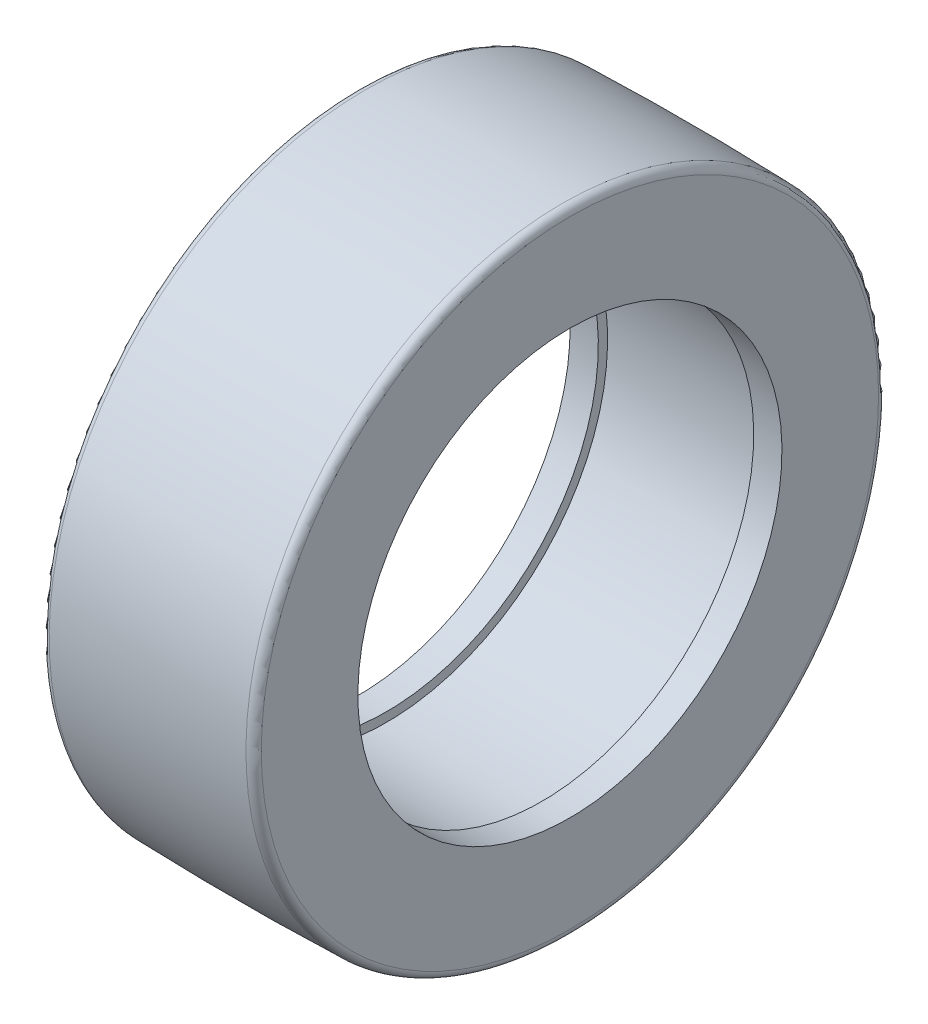
ISO-10303-21;
HEADER;
FILE_DESCRIPTION(('STEP AP214'),'2;1');
FILE_NAME('part.step','',(''),(''),'','','');
FILE_SCHEMA(('AUTOMOTIVE_DESIGN { 1 0 10303 214 1 1 1 1 }'));
ENDSEC;
DATA;
#1=APPLICATION_CONTEXT('core data for automotive mechanical design processes');
#2=APPLICATION_PROTOCOL_DEFINITION('international standard','automotive_design',2000,#1);
#3=PRODUCT_CONTEXT('',#1,'mechanical');
#4=PRODUCT('Part','Part','',(#3));
#5=PRODUCT_RELATED_PRODUCT_CATEGORY('part','',(#4));
#6=PRODUCT_DEFINITION_FORMATION('','',#4);
#7=PRODUCT_DEFINITION_CONTEXT('part definition',#1,'design');
#8=PRODUCT_DEFINITION('design','',#6,#7);
#9=PRODUCT_DEFINITION_SHAPE('','',#8);
#10=(LENGTH_UNIT() NAMED_UNIT(*) SI_UNIT(.MILLI.,.METRE.));
#11=(NAMED_UNIT(*) PLANE_ANGLE_UNIT() SI_UNIT($,.RADIAN.));
#12=(NAMED_UNIT(*) SI_UNIT($,.STERADIAN.) SOLID_ANGLE_UNIT());
#13=UNCERTAINTY_MEASURE_WITH_UNIT(LENGTH_MEASURE(1.E-05),#10,'distance_accuracy_value','');
#14=(GEOMETRIC_REPRESENTATION_CONTEXT(3) GLOBAL_UNCERTAINTY_ASSIGNED_CONTEXT((#13)) GLOBAL_UNIT_ASSIGNED_CONTEXT((#10,
#11,#12)) REPRESENTATION_CONTEXT('',''));
#15=CARTESIAN_POINT('',(0.,0.,0.));
#16=DIRECTION('',(0.,0.,1.));
#17=DIRECTION('',(1.,0.,0.));
#18=AXIS2_PLACEMENT_3D('',#15,#16,#17);
#19=CARTESIAN_POINT('',(1.1,0.,0.));
#20=DIRECTION('',(1.,0.,0.));
#21=DIRECTION('',(0.,0.,-1.));
#22=AXIS2_PLACEMENT_3D('',#19,#20,#21);
#23=TOROIDAL_SURFACE('',#22,43.7063264086391,1.1);
#24=CARTESIAN_POINT('',(0.,0.,0.));
#25=DIRECTION('',(1.,0.,0.));
#26=DIRECTION('',(0.,1.,0.));
#27=AXIS2_PLACEMENT_3D('',#24,#25,#26);
#28=CIRCLE('',#27,43.7063264086391);
#29=CARTESIAN_POINT('',(0.,43.7063264086391,0.));
#30=VERTEX_POINT('',#29);
#31=EDGE_CURVE('E11',#30,#30,#28,.T.);
#32=ORIENTED_EDGE('',*,*,#31,.T.);
#33=EDGE_LOOP('',(#32));
#34=FACE_BOUND('',#33,.T.);
#35=CARTESIAN_POINT('',(1.0693525756665,0.,0.));
#36=DIRECTION('',(1.,0.,0.));
#37=DIRECTION('',(0.,1.,0.));
#38=AXIS2_PLACEMENT_3D('',#35,#36,#37);
#39=CIRCLE('',#38,44.805899387291);
#40=CARTESIAN_POINT('',(1.0693525756665,44.805899387291,0.));
#41=VERTEX_POINT('',#40);
#42=EDGE_CURVE('E110',#41,#41,#39,.T.);
#43=ORIENTED_EDGE('',*,*,#42,.F.);
#44=EDGE_LOOP('',(#43));
#45=FACE_BOUND('',#44,.T.);
#46=ADVANCED_FACE('F17',(#34,#45),#23,.T.);
#47=CARTESIAN_POINT('',(0.,36.8669132043195,0.));
#48=DIRECTION('',(-1.,0.,0.));
#49=DIRECTION('',(0.,-1.,0.));
#50=AXIS2_PLACEMENT_3D('',#47,#48,#49);
#51=PLANE('',#50);
#52=CARTESIAN_POINT('',(0.,0.,0.));
#53=DIRECTION('',(1.,0.,0.));
#54=DIRECTION('',(0.,1.,0.));
#55=AXIS2_PLACEMENT_3D('',#52,#53,#54);
#56=CIRCLE('',#55,30.0275);
#57=CARTESIAN_POINT('',(0.,30.0275,0.));
#58=VERTEX_POINT('',#57);
#59=EDGE_CURVE('E26',#58,#58,#56,.T.);
#60=ORIENTED_EDGE('',*,*,#59,.T.);
#61=EDGE_LOOP('',(#60));
#62=FACE_BOUND('',#61,.T.);
#63=ORIENTED_EDGE('',*,*,#31,.F.);
#64=EDGE_LOOP('',(#63));
#65=FACE_BOUND('',#64,.T.);
#66=ADVANCED_FACE('F19',(#62,#65),#51,.T.);
#67=CARTESIAN_POINT('',(2.,0.,0.));
#68=DIRECTION('',(-1.,0.,0.));
#69=DIRECTION('',(0.,1.,0.));
#70=AXIS2_PLACEMENT_3D('',#67,#68,#69);
#71=CYLINDRICAL_SURFACE('',#70,30.0275);
#72=CARTESIAN_POINT('',(4.,0.,0.));
#73=DIRECTION('',(1.,0.,0.));
#74=DIRECTION('',(0.,1.,0.));
#75=AXIS2_PLACEMENT_3D('',#72,#73,#74);
#76=CIRCLE('',#75,30.0275);
#77=CARTESIAN_POINT('',(4.,30.0275,0.));
#78=VERTEX_POINT('',#77);
#79=EDGE_CURVE('E68',#78,#78,#76,.T.);
#80=ORIENTED_EDGE('',*,*,#79,.T.);
#81=EDGE_LOOP('',(#80));
#82=FACE_BOUND('',#81,.T.);
#83=ORIENTED_EDGE('',*,*,#59,.F.);
#84=EDGE_LOOP('',(#83));
#85=FACE_BOUND('',#84,.T.);
#86=ADVANCED_FACE('F79',(#82,#85),#71,.F.);
#87=CARTESIAN_POINT('',(4.,30.68375,0.));
#88=DIRECTION('',(1.,0.,0.));
#89=DIRECTION('',(0.,1.,0.));
#90=AXIS2_PLACEMENT_3D('',#87,#88,#89);
#91=PLANE('',#90);
#92=CARTESIAN_POINT('',(4.,0.,0.));
#93=DIRECTION('',(1.,0.,0.));
#94=DIRECTION('',(0.,1.,0.));
#95=AXIS2_PLACEMENT_3D('',#92,#93,#94);
#96=CIRCLE('',#95,31.34);
#97=CARTESIAN_POINT('',(4.,31.34,0.));
#98=VERTEX_POINT('',#97);
#99=EDGE_CURVE('E64',#98,#98,#96,.T.);
#100=ORIENTED_EDGE('',*,*,#99,.T.);
#101=EDGE_LOOP('',(#100));
#102=FACE_BOUND('',#101,.T.);
#103=ORIENTED_EDGE('',*,*,#79,.F.);
#104=EDGE_LOOP('',(#103));
#105=FACE_BOUND('',#104,.T.);
#106=ADVANCED_FACE('F65',(#102,#105),#91,.T.);
#107=CARTESIAN_POINT('',(15.,0.,0.));
#108=DIRECTION('',(-1.,0.,0.));
#109=DIRECTION('',(0.,1.,0.));
#110=AXIS2_PLACEMENT_3D('',#107,#108,#109);
#111=CYLINDRICAL_SURFACE('',#110,31.34);
#112=CARTESIAN_POINT('',(26.,0.,0.));
#113=DIRECTION('',(1.,0.,0.));
#114=DIRECTION('',(0.,1.,0.));
#115=AXIS2_PLACEMENT_3D('',#112,#113,#114);
#116=CIRCLE('',#115,31.34);
#117=CARTESIAN_POINT('',(26.,31.34,0.));
#118=VERTEX_POINT('',#117);
#119=EDGE_CURVE('E60',#118,#118,#116,.T.);
#120=ORIENTED_EDGE('',*,*,#119,.T.);
#121=EDGE_LOOP('',(#120));
#122=FACE_BOUND('',#121,.T.);
#123=ORIENTED_EDGE('',*,*,#99,.F.);
#124=EDGE_LOOP('',(#123));
#125=FACE_BOUND('',#124,.T.);
#126=ADVANCED_FACE('F87',(#122,#125),#111,.F.);
#127=CARTESIAN_POINT('',(26.,30.68375,0.));
#128=DIRECTION('',(-1.,0.,0.));
#129=DIRECTION('',(0.,-1.,0.));
#130=AXIS2_PLACEMENT_3D('',#127,#128,#129);
#131=PLANE('',#130);
#132=CARTESIAN_POINT('',(26.,0.,0.));
#133=DIRECTION('',(1.,0.,0.));
#134=DIRECTION('',(0.,1.,0.));
#135=AXIS2_PLACEMENT_3D('',#132,#133,#134);
#136=CIRCLE('',#135,30.0275);
#137=CARTESIAN_POINT('',(26.,30.0275,0.));
#138=VERTEX_POINT('',#137);
#139=EDGE_CURVE('E71',#138,#138,#136,.T.);
#140=ORIENTED_EDGE('',*,*,#139,.T.);
#141=EDGE_LOOP('',(#140));
#142=FACE_BOUND('',#141,.T.);
#143=ORIENTED_EDGE('',*,*,#119,.F.);
#144=EDGE_LOOP('',(#143));
#145=FACE_BOUND('',#144,.T.);
#146=ADVANCED_FACE('F96',(#142,#145),#131,.T.);
#147=CARTESIAN_POINT('',(28.,0.,0.));
#148=DIRECTION('',(-1.,0.,0.));
#149=DIRECTION('',(0.,1.,0.));
#150=AXIS2_PLACEMENT_3D('',#147,#148,#149);
#151=CYLINDRICAL_SURFACE('',#150,30.0275);
#152=CARTESIAN_POINT('',(30.,0.,0.));
#153=DIRECTION('',(1.,0.,0.));
#154=DIRECTION('',(0.,1.,0.));
#155=AXIS2_PLACEMENT_3D('',#152,#153,#154);
#156=CIRCLE('',#155,30.0275);
#157=CARTESIAN_POINT('',(30.,30.0275,0.));
#158=VERTEX_POINT('',#157);
#159=EDGE_CURVE('E48',#158,#158,#156,.T.);
#160=ORIENTED_EDGE('',*,*,#159,.T.);
#161=EDGE_LOOP('',(#160));
#162=FACE_BOUND('',#161,.T.);
#163=ORIENTED_EDGE('',*,*,#139,.F.);
#164=EDGE_LOOP('',(#163));
#165=FACE_BOUND('',#164,.T.);
#166=ADVANCED_FACE('F121',(#162,#165),#151,.F.);
#167=CARTESIAN_POINT('',(30.,36.8669132043195,0.));
#168=DIRECTION('',(1.,0.,0.));
#169=DIRECTION('',(0.,1.,0.));
#170=AXIS2_PLACEMENT_3D('',#167,#168,#169);
#171=PLANE('',#170);
#172=CARTESIAN_POINT('',(30.,0.,0.));
#173=DIRECTION('',(1.,0.,0.));
#174=DIRECTION('',(0.,1.,0.));
#175=AXIS2_PLACEMENT_3D('',#172,#173,#174);
#176=CIRCLE('',#175,43.7063264086391);
#177=CARTESIAN_POINT('',(30.,43.7063264086391,0.));
#178=VERTEX_POINT('',#177);
#179=EDGE_CURVE('E53',#178,#178,#176,.T.);
#180=ORIENTED_EDGE('',*,*,#179,.T.);
#181=EDGE_LOOP('',(#180));
#182=FACE_BOUND('',#181,.T.);
#183=ORIENTED_EDGE('',*,*,#159,.F.);
#184=EDGE_LOOP('',(#183));
#185=FACE_BOUND('',#184,.T.);
#186=ADVANCED_FACE('F102',(#182,#185),#171,.T.);
#187=CARTESIAN_POINT('',(28.9,0.,0.));
#188=DIRECTION('',(1.,0.,0.));
#189=DIRECTION('',(0.,0.,-1.));
#190=AXIS2_PLACEMENT_3D('',#187,#188,#189);
#191=TOROIDAL_SURFACE('',#190,43.7063264086391,1.1);
#192=CARTESIAN_POINT('',(28.9306474243335,0.,0.));
#193=DIRECTION('',(1.,0.,0.));
#194=DIRECTION('',(0.,1.,0.));
#195=AXIS2_PLACEMENT_3D('',#192,#193,#194);
#196=CIRCLE('',#195,44.805899387291);
#197=CARTESIAN_POINT('',(28.9306474243335,44.805899387291,0.));
#198=VERTEX_POINT('',#197);
#199=EDGE_CURVE('E113',#198,#198,#196,.T.);
#200=ORIENTED_EDGE('',*,*,#199,.T.);
#201=EDGE_LOOP('',(#200));
#202=FACE_BOUND('',#201,.T.);
#203=ORIENTED_EDGE('',*,*,#179,.F.);
#204=EDGE_LOOP('',(#203));
#205=FACE_BOUND('',#204,.T.);
#206=ADVANCED_FACE('F99',(#202,#205),#191,.T.);
#207=CARTESIAN_POINT('',(15.,0.,0.));
#208=DIRECTION('',(1.,0.,0.));
#209=DIRECTION('',(0.,0.,1.));
#210=AXIS2_PLACEMENT_3D('',#207,#208,#209);
#211=DEGENERATE_TOROIDAL_SURFACE('',#210,455.,500.,.F.);
#212=ORIENTED_EDGE('',*,*,#42,.T.);
#213=EDGE_LOOP('',(#212));
#214=FACE_BOUND('',#213,.T.);
#215=ORIENTED_EDGE('',*,*,#199,.F.);
#216=EDGE_LOOP('',(#215));
#217=FACE_BOUND('',#216,.T.);
#218=ADVANCED_FACE('F101',(#214,#217),#211,.F.);
#219=CLOSED_SHELL('',(#46,#66,#86,#106,#126,#146,#166,#186,#206,#218));
#220=MANIFOLD_SOLID_BREP('B1',#219);
#221=ADVANCED_BREP_SHAPE_REPRESENTATION('',(#18,#220),#14);
#222=SHAPE_DEFINITION_REPRESENTATION(#9,#221);
ENDSEC;
END-ISO-10303-21;
